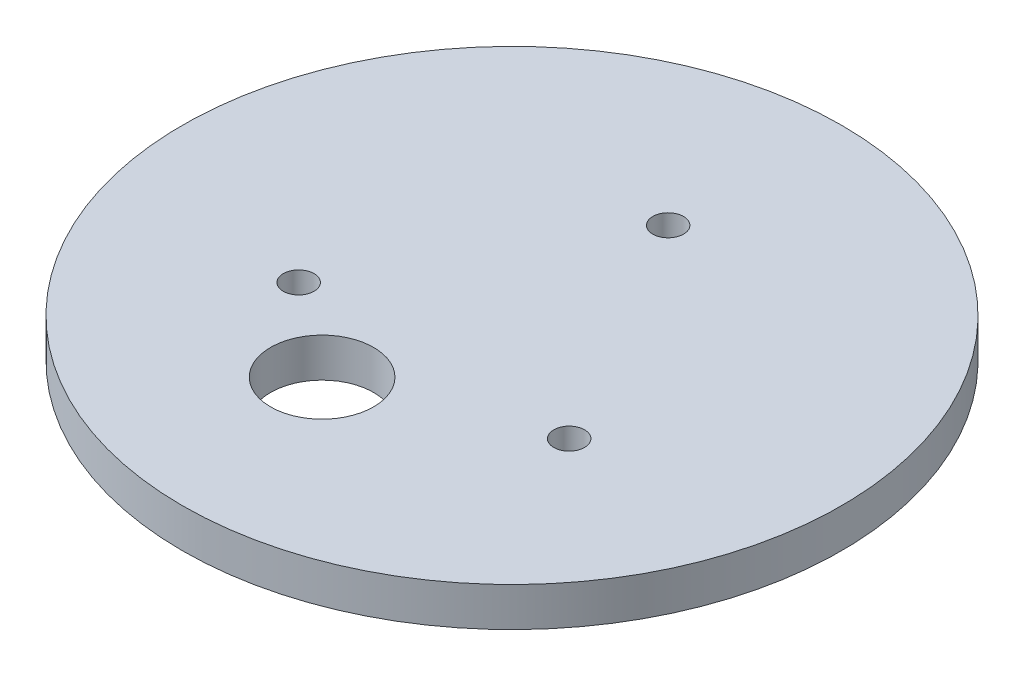
ISO-10303-21;
HEADER;
FILE_DESCRIPTION(('STEP AP214'),'2;1');
FILE_NAME('part.step','',(''),(''),'','','');
FILE_SCHEMA(('AUTOMOTIVE_DESIGN { 1 0 10303 214 1 1 1 1 }'));
ENDSEC;
DATA;
#1=APPLICATION_CONTEXT('core data for automotive mechanical design processes');
#2=APPLICATION_PROTOCOL_DEFINITION('international standard','automotive_design',2000,#1);
#3=PRODUCT_CONTEXT('',#1,'mechanical');
#4=PRODUCT('Part','Part','',(#3));
#5=PRODUCT_RELATED_PRODUCT_CATEGORY('part','',(#4));
#6=PRODUCT_DEFINITION_FORMATION('','',#4);
#7=PRODUCT_DEFINITION_CONTEXT('part definition',#1,'design');
#8=PRODUCT_DEFINITION('design','',#6,#7);
#9=PRODUCT_DEFINITION_SHAPE('','',#8);
#10=(LENGTH_UNIT() NAMED_UNIT(*) SI_UNIT(.MILLI.,.METRE.));
#11=(NAMED_UNIT(*) PLANE_ANGLE_UNIT() SI_UNIT($,.RADIAN.));
#12=(NAMED_UNIT(*) SI_UNIT($,.STERADIAN.) SOLID_ANGLE_UNIT());
#13=UNCERTAINTY_MEASURE_WITH_UNIT(LENGTH_MEASURE(1.E-05),#10,'distance_accuracy_value','');
#14=(GEOMETRIC_REPRESENTATION_CONTEXT(3) GLOBAL_UNCERTAINTY_ASSIGNED_CONTEXT((#13)) GLOBAL_UNIT_ASSIGNED_CONTEXT((#10,
#11,#12)) REPRESENTATION_CONTEXT('',''));
#15=CARTESIAN_POINT('',(0.,0.,0.));
#16=DIRECTION('',(0.,0.,1.));
#17=DIRECTION('',(1.,0.,0.));
#18=AXIS2_PLACEMENT_3D('',#15,#16,#17);
#19=CARTESIAN_POINT('',(0.,3.175,0.));
#20=DIRECTION('',(0.,-1.,0.));
#21=DIRECTION('',(0.,0.,-1.));
#22=AXIS2_PLACEMENT_3D('',#19,#20,#21);
#23=CYLINDRICAL_SURFACE('',#22,26.799999994);
#24=CARTESIAN_POINT('',(0.,3.175,0.));
#25=DIRECTION('',(0.,1.,0.));
#26=DIRECTION('',(0.,0.,1.));
#27=AXIS2_PLACEMENT_3D('',#24,#25,#26);
#28=CIRCLE('',#27,26.799999994);
#29=CARTESIAN_POINT('',(0.,3.175,26.799999994));
#30=VERTEX_POINT('',#29);
#31=EDGE_CURVE('E10',#30,#30,#28,.T.);
#32=ORIENTED_EDGE('',*,*,#31,.F.);
#33=EDGE_LOOP('',(#32));
#34=FACE_BOUND('',#33,.T.);
#35=CARTESIAN_POINT('',(0.,0.,0.));
#36=DIRECTION('',(0.,1.,0.));
#37=DIRECTION('',(0.,0.,1.));
#38=AXIS2_PLACEMENT_3D('',#35,#36,#37);
#39=CIRCLE('',#38,26.799999994);
#40=CARTESIAN_POINT('',(0.,0.,26.799999994));
#41=VERTEX_POINT('',#40);
#42=EDGE_CURVE('E43',#41,#41,#39,.T.);
#43=ORIENTED_EDGE('',*,*,#42,.T.);
#44=EDGE_LOOP('',(#43));
#45=FACE_BOUND('',#44,.T.);
#46=ADVANCED_FACE('F36',(#34,#45),#23,.T.);
#47=CARTESIAN_POINT('',(0.,3.175,0.));
#48=DIRECTION('',(0.,1.,0.));
#49=DIRECTION('',(0.,0.,1.));
#50=AXIS2_PLACEMENT_3D('',#47,#48,#49);
#51=PLANE('',#50);
#52=CARTESIAN_POINT('',(-3.37852262806243,3.175,12.0650000000001));
#53=DIRECTION('',(0.,1.,0.));
#54=DIRECTION('',(0.,0.,1.));
#55=AXIS2_PLACEMENT_3D('',#52,#53,#54);
#56=CIRCLE('',#55,4.191);
#57=CARTESIAN_POINT('',(-3.37852262806243,3.175,16.256));
#58=VERTEX_POINT('',#57);
#59=EDGE_CURVE('E67',#58,#58,#56,.T.);
#60=ORIENTED_EDGE('',*,*,#59,.F.);
#61=EDGE_LOOP('',(#60));
#62=FACE_BOUND('',#61,.T.);
#63=CARTESIAN_POINT('',(10.9985226280623,3.175,6.35000000000005));
#64=DIRECTION('',(0.,1.,0.));
#65=DIRECTION('',(0.,0.,1.));
#66=AXIS2_PLACEMENT_3D('',#63,#64,#65);
#67=CIRCLE('',#66,1.25);
#68=CARTESIAN_POINT('',(10.9985226280623,3.175,7.60000000000005));
#69=VERTEX_POINT('',#68);
#70=EDGE_CURVE('E62',#69,#69,#67,.T.);
#71=ORIENTED_EDGE('',*,*,#70,.F.);
#72=EDGE_LOOP('',(#71));
#73=FACE_BOUND('',#72,.T.);
#74=CARTESIAN_POINT('',(0.,3.175,-12.7));
#75=DIRECTION('',(0.,1.,0.));
#76=DIRECTION('',(0.,0.,1.));
#77=AXIS2_PLACEMENT_3D('',#74,#75,#76);
#78=CIRCLE('',#77,1.25);
#79=CARTESIAN_POINT('',(0.,3.175,-11.45));
#80=VERTEX_POINT('',#79);
#81=EDGE_CURVE('E56',#80,#80,#78,.T.);
#82=ORIENTED_EDGE('',*,*,#81,.F.);
#83=EDGE_LOOP('',(#82));
#84=FACE_BOUND('',#83,.T.);
#85=CARTESIAN_POINT('',(-10.9985226280624,3.175,6.3499999999999));
#86=DIRECTION('',(0.,1.,0.));
#87=DIRECTION('',(0.,0.,1.));
#88=AXIS2_PLACEMENT_3D('',#85,#86,#87);
#89=CIRCLE('',#88,1.25);
#90=CARTESIAN_POINT('',(-10.9985226280624,3.175,7.5999999999999));
#91=VERTEX_POINT('',#90);
#92=EDGE_CURVE('E50',#91,#91,#89,.T.);
#93=ORIENTED_EDGE('',*,*,#92,.F.);
#94=EDGE_LOOP('',(#93));
#95=FACE_BOUND('',#94,.T.);
#96=ORIENTED_EDGE('',*,*,#31,.T.);
#97=EDGE_LOOP('',(#96));
#98=FACE_BOUND('',#97,.T.);
#99=ADVANCED_FACE('F88',(#62,#73,#84,#95,#98),#51,.T.);
#100=CARTESIAN_POINT('',(0.,0.,0.));
#101=DIRECTION('',(0.,1.,0.));
#102=DIRECTION('',(0.,0.,1.));
#103=AXIS2_PLACEMENT_3D('',#100,#101,#102);
#104=PLANE('',#103);
#105=CARTESIAN_POINT('',(-3.37852262806243,0.,12.0650000000001));
#106=DIRECTION('',(0.,1.,0.));
#107=DIRECTION('',(0.,0.,1.));
#108=AXIS2_PLACEMENT_3D('',#105,#106,#107);
#109=CIRCLE('',#108,4.191);
#110=CARTESIAN_POINT('',(-3.37852262806243,0.,16.256));
#111=VERTEX_POINT('',#110);
#112=EDGE_CURVE('E39',#111,#111,#109,.T.);
#113=ORIENTED_EDGE('',*,*,#112,.T.);
#114=EDGE_LOOP('',(#113));
#115=FACE_BOUND('',#114,.T.);
#116=CARTESIAN_POINT('',(10.9985226280623,0.,6.35000000000005));
#117=DIRECTION('',(0.,1.,0.));
#118=DIRECTION('',(0.,0.,1.));
#119=AXIS2_PLACEMENT_3D('',#116,#117,#118);
#120=CIRCLE('',#119,1.25);
#121=CARTESIAN_POINT('',(10.9985226280623,0.,7.60000000000005));
#122=VERTEX_POINT('',#121);
#123=EDGE_CURVE('E59',#122,#122,#120,.T.);
#124=ORIENTED_EDGE('',*,*,#123,.T.);
#125=EDGE_LOOP('',(#124));
#126=FACE_BOUND('',#125,.T.);
#127=CARTESIAN_POINT('',(0.,0.,-12.7));
#128=DIRECTION('',(0.,1.,0.));
#129=DIRECTION('',(0.,0.,1.));
#130=AXIS2_PLACEMENT_3D('',#127,#128,#129);
#131=CIRCLE('',#130,1.25);
#132=CARTESIAN_POINT('',(0.,0.,-11.45));
#133=VERTEX_POINT('',#132);
#134=EDGE_CURVE('E53',#133,#133,#131,.T.);
#135=ORIENTED_EDGE('',*,*,#134,.T.);
#136=EDGE_LOOP('',(#135));
#137=FACE_BOUND('',#136,.T.);
#138=CARTESIAN_POINT('',(-10.9985226280624,0.,6.3499999999999));
#139=DIRECTION('',(0.,1.,0.));
#140=DIRECTION('',(0.,0.,1.));
#141=AXIS2_PLACEMENT_3D('',#138,#139,#140);
#142=CIRCLE('',#141,1.25);
#143=CARTESIAN_POINT('',(-10.9985226280624,0.,7.5999999999999));
#144=VERTEX_POINT('',#143);
#145=EDGE_CURVE('E48',#144,#144,#142,.T.);
#146=ORIENTED_EDGE('',*,*,#145,.T.);
#147=EDGE_LOOP('',(#146));
#148=FACE_BOUND('',#147,.T.);
#149=ORIENTED_EDGE('',*,*,#42,.F.);
#150=EDGE_LOOP('',(#149));
#151=FACE_BOUND('',#150,.T.);
#152=ADVANCED_FACE('F74',(#115,#126,#137,#148,#151),#104,.F.);
#153=CARTESIAN_POINT('',(-10.9985226280624,0.,6.3499999999999));
#154=DIRECTION('',(0.,1.,0.));
#155=DIRECTION('',(0.,0.,1.));
#156=AXIS2_PLACEMENT_3D('',#153,#154,#155);
#157=CYLINDRICAL_SURFACE('',#156,1.25);
#158=ORIENTED_EDGE('',*,*,#145,.F.);
#159=EDGE_LOOP('',(#158));
#160=FACE_BOUND('',#159,.T.);
#161=ORIENTED_EDGE('',*,*,#92,.T.);
#162=EDGE_LOOP('',(#161));
#163=FACE_BOUND('',#162,.T.);
#164=ADVANCED_FACE('F99',(#160,#163),#157,.F.);
#165=CARTESIAN_POINT('',(0.,0.,-12.7));
#166=DIRECTION('',(0.,1.,0.));
#167=DIRECTION('',(0.,0.,1.));
#168=AXIS2_PLACEMENT_3D('',#165,#166,#167);
#169=CYLINDRICAL_SURFACE('',#168,1.25);
#170=ORIENTED_EDGE('',*,*,#134,.F.);
#171=EDGE_LOOP('',(#170));
#172=FACE_BOUND('',#171,.T.);
#173=ORIENTED_EDGE('',*,*,#81,.T.);
#174=EDGE_LOOP('',(#173));
#175=FACE_BOUND('',#174,.T.);
#176=ADVANCED_FACE('F84',(#172,#175),#169,.F.);
#177=CARTESIAN_POINT('',(10.9985226280623,0.,6.35000000000005));
#178=DIRECTION('',(0.,1.,0.));
#179=DIRECTION('',(0.,0.,1.));
#180=AXIS2_PLACEMENT_3D('',#177,#178,#179);
#181=CYLINDRICAL_SURFACE('',#180,1.25);
#182=ORIENTED_EDGE('',*,*,#123,.F.);
#183=EDGE_LOOP('',(#182));
#184=FACE_BOUND('',#183,.T.);
#185=ORIENTED_EDGE('',*,*,#70,.T.);
#186=EDGE_LOOP('',(#185));
#187=FACE_BOUND('',#186,.T.);
#188=ADVANCED_FACE('F79',(#184,#187),#181,.F.);
#189=CARTESIAN_POINT('',(-3.37852262806243,-4.445,12.0650000000001));
#190=DIRECTION('',(0.,1.,0.));
#191=DIRECTION('',(0.,0.,1.));
#192=AXIS2_PLACEMENT_3D('',#189,#190,#191);
#193=CYLINDRICAL_SURFACE('',#192,4.191);
#194=CARTESIAN_POINT('',(-3.37852262806243,3.175,16.256));
#195=CARTESIAN_POINT('',(-3.37852262806243,3.14192708333333,16.256));
#196=CARTESIAN_POINT('',(-3.37852262806243,3.10885416666667,16.256));
#197=CARTESIAN_POINT('',(-3.37852262806243,3.04270833333333,16.256));
#198=CARTESIAN_POINT('',(-3.37852262806243,3.00963541666667,16.256));
#199=CARTESIAN_POINT('',(-3.37852262806243,2.94348958333333,16.256));
#200=CARTESIAN_POINT('',(-3.37852262806243,2.91041666666667,16.256));
#201=CARTESIAN_POINT('',(-3.37852262806243,2.84427083333333,16.256));
#202=CARTESIAN_POINT('',(-3.37852262806243,2.81119791666667,16.256));
#203=CARTESIAN_POINT('',(-3.37852262806243,2.74505208333333,16.256));
#204=CARTESIAN_POINT('',(-3.37852262806243,2.71197916666667,16.256));
#205=CARTESIAN_POINT('',(-3.37852262806243,2.64583333333333,16.256));
#206=CARTESIAN_POINT('',(-3.37852262806243,2.61276041666667,16.256));
#207=CARTESIAN_POINT('',(-3.37852262806243,2.54661458333333,16.256));
#208=CARTESIAN_POINT('',(-3.37852262806243,2.51354166666667,16.256));
#209=CARTESIAN_POINT('',(-3.37852262806243,2.44739583333333,16.256));
#210=CARTESIAN_POINT('',(-3.37852262806243,2.41432291666667,16.256));
#211=CARTESIAN_POINT('',(-3.37852262806243,2.34817708333333,16.256));
#212=CARTESIAN_POINT('',(-3.37852262806243,2.31510416666667,16.256));
#213=CARTESIAN_POINT('',(-3.37852262806243,2.24895833333333,16.256));
#214=CARTESIAN_POINT('',(-3.37852262806243,2.21588541666667,16.256));
#215=CARTESIAN_POINT('',(-3.37852262806243,2.14973958333333,16.256));
#216=CARTESIAN_POINT('',(-3.37852262806243,2.11666666666667,16.256));
#217=CARTESIAN_POINT('',(-3.37852262806243,2.05052083333333,16.256));
#218=CARTESIAN_POINT('',(-3.37852262806243,2.01744791666667,16.256));
#219=CARTESIAN_POINT('',(-3.37852262806243,1.95130208333333,16.256));
#220=CARTESIAN_POINT('',(-3.37852262806243,1.91822916666667,16.256));
#221=CARTESIAN_POINT('',(-3.37852262806243,1.85208333333333,16.256));
#222=CARTESIAN_POINT('',(-3.37852262806243,1.81901041666667,16.256));
#223=CARTESIAN_POINT('',(-3.37852262806243,1.75286458333333,16.256));
#224=CARTESIAN_POINT('',(-3.37852262806243,1.71979166666667,16.256));
#225=CARTESIAN_POINT('',(-3.37852262806243,1.65364583333333,16.256));
#226=CARTESIAN_POINT('',(-3.37852262806243,1.62057291666667,16.256));
#227=CARTESIAN_POINT('',(-3.37852262806243,1.55442708333333,16.256));
#228=CARTESIAN_POINT('',(-3.37852262806243,1.52135416666667,16.256));
#229=CARTESIAN_POINT('',(-3.37852262806243,1.45520833333333,16.256));
#230=CARTESIAN_POINT('',(-3.37852262806243,1.42213541666667,16.256));
#231=CARTESIAN_POINT('',(-3.37852262806243,1.35598958333333,16.256));
#232=CARTESIAN_POINT('',(-3.37852262806243,1.32291666666667,16.256));
#233=CARTESIAN_POINT('',(-3.37852262806243,1.25677083333333,16.256));
#234=CARTESIAN_POINT('',(-3.37852262806243,1.22369791666667,16.256));
#235=CARTESIAN_POINT('',(-3.37852262806243,1.15755208333333,16.256));
#236=CARTESIAN_POINT('',(-3.37852262806243,1.12447916666667,16.256));
#237=CARTESIAN_POINT('',(-3.37852262806243,1.05833333333333,16.256));
#238=CARTESIAN_POINT('',(-3.37852262806243,1.02526041666667,16.256));
#239=CARTESIAN_POINT('',(-3.37852262806243,0.959114583333333,16.256));
#240=CARTESIAN_POINT('',(-3.37852262806243,0.926041666666666,16.256));
#241=CARTESIAN_POINT('',(-3.37852262806243,0.859895833333333,16.256));
#242=CARTESIAN_POINT('',(-3.37852262806243,0.826822916666666,16.256));
#243=CARTESIAN_POINT('',(-3.37852262806243,0.760677083333333,16.256));
#244=CARTESIAN_POINT('',(-3.37852262806243,0.727604166666666,16.256));
#245=CARTESIAN_POINT('',(-3.37852262806243,0.661458333333332,16.256));
#246=CARTESIAN_POINT('',(-3.37852262806243,0.628385416666666,16.256));
#247=CARTESIAN_POINT('',(-3.37852262806243,0.562239583333333,16.256));
#248=CARTESIAN_POINT('',(-3.37852262806243,0.529166666666666,16.256));
#249=CARTESIAN_POINT('',(-3.37852262806243,0.463020833333332,16.256));
#250=CARTESIAN_POINT('',(-3.37852262806243,0.429947916666666,16.256));
#251=CARTESIAN_POINT('',(-3.37852262806243,0.363802083333332,16.256));
#252=CARTESIAN_POINT('',(-3.37852262806243,0.330729166666666,16.256));
#253=CARTESIAN_POINT('',(-3.37852262806243,0.264583333333333,16.256));
#254=CARTESIAN_POINT('',(-3.37852262806243,0.231510416666666,16.256));
#255=CARTESIAN_POINT('',(-3.37852262806243,0.165364583333332,16.256));
#256=CARTESIAN_POINT('',(-3.37852262806243,0.132291666666665,16.256));
#257=CARTESIAN_POINT('',(-3.37852262806243,0.0661458333333321,16.256));
#258=CARTESIAN_POINT('',(-3.37852262806243,0.0330729166666657,16.256));
#259=CARTESIAN_POINT('',(-3.37852262806243,0.,16.256));
#260=B_SPLINE_CURVE_WITH_KNOTS('',3,(#194,#195,#196,#197,#198,#199,#200,#201,#202,#203,#204,
#205,#206,#207,#208,#209,#210,#211,#212,#213,#214,#215,#216,#217,#218,#219,#220,#221,#222,#223,
#224,#225,#226,#227,#228,#229,#230,#231,#232,#233,#234,#235,#236,#237,#238,#239,#240,#241,#242,
#243,#244,#245,#246,#247,#248,#249,#250,#251,#252,#253,#254,#255,#256,#257,#258,#259),
.UNSPECIFIED.,.F.,.F.,(4,2,2,2,2,2,2,2,2,2,2,2,2,2,2,2,2,2,2,2,2,2,2,2,2,2,2,2,2,2,2,2,4),(0.,
0.0992187500000004,0.1984375,0.29765625,0.396875,0.49609375,0.5953125,0.69453125,0.79375,
0.892968750000001,0.9921875,1.09140625,1.190625,1.28984375,1.3890625,1.48828125,1.5875,
1.68671875,1.7859375,1.88515625,1.984375,2.08359375,2.1828125,2.28203125,2.38125,2.48046875,
2.5796875,2.67890625,2.778125,2.87734375,2.9765625,3.07578125,3.175),.UNSPECIFIED.);
#261=EDGE_CURVE('BSEAM77',#58,#111,#260,.T.);
#262=ORIENTED_EDGE('',*,*,#59,.T.);
#263=ORIENTED_EDGE('',*,*,#112,.F.);
#264=ORIENTED_EDGE('',*,*,#261,.T.);
#265=ORIENTED_EDGE('',*,*,#261,.F.);
#266=EDGE_LOOP('',(#262,#264,#263,#265));
#267=FACE_BOUND('',#266,.T.);
#268=ADVANCED_FACE('F77',(#267),#193,.F.);
#269=CLOSED_SHELL('',(#46,#99,#152,#164,#176,#188,#268));
#270=MANIFOLD_SOLID_BREP('B2',#269);
#271=ADVANCED_BREP_SHAPE_REPRESENTATION('',(#18,#270),#14);
#272=SHAPE_DEFINITION_REPRESENTATION(#9,#271);
ENDSEC;
END-ISO-10303-21;
